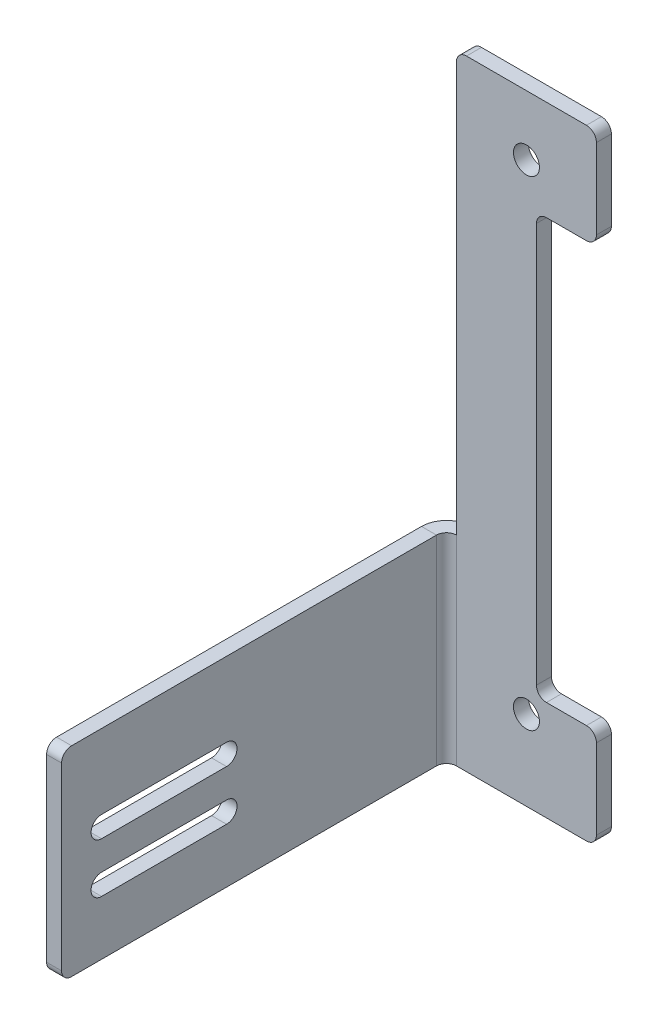
ISO-10303-21;
HEADER;
FILE_DESCRIPTION(('STEP AP214'),'2;1');
FILE_NAME('part.step','',(''),(''),'','','');
FILE_SCHEMA(('AUTOMOTIVE_DESIGN { 1 0 10303 214 1 1 1 1 }'));
ENDSEC;
DATA;
#1=APPLICATION_CONTEXT('core data for automotive mechanical design processes');
#2=APPLICATION_PROTOCOL_DEFINITION('international standard','automotive_design',2000,#1);
#3=PRODUCT_CONTEXT('',#1,'mechanical');
#4=PRODUCT('Part','Part','',(#3));
#5=PRODUCT_RELATED_PRODUCT_CATEGORY('part','',(#4));
#6=PRODUCT_DEFINITION_FORMATION('','',#4);
#7=PRODUCT_DEFINITION_CONTEXT('part definition',#1,'design');
#8=PRODUCT_DEFINITION('design','',#6,#7);
#9=PRODUCT_DEFINITION_SHAPE('','',#8);
#10=(LENGTH_UNIT() NAMED_UNIT(*) SI_UNIT(.MILLI.,.METRE.));
#11=(NAMED_UNIT(*) PLANE_ANGLE_UNIT() SI_UNIT($,.RADIAN.));
#12=(NAMED_UNIT(*) SI_UNIT($,.STERADIAN.) SOLID_ANGLE_UNIT());
#13=UNCERTAINTY_MEASURE_WITH_UNIT(LENGTH_MEASURE(1.E-05),#10,'distance_accuracy_value','');
#14=(GEOMETRIC_REPRESENTATION_CONTEXT(3) GLOBAL_UNCERTAINTY_ASSIGNED_CONTEXT((#13)) GLOBAL_UNIT_ASSIGNED_CONTEXT((#10,
#11,#12)) REPRESENTATION_CONTEXT('',''));
#15=CARTESIAN_POINT('',(0.,0.,0.));
#16=DIRECTION('',(0.,0.,1.));
#17=DIRECTION('',(1.,0.,0.));
#18=AXIS2_PLACEMENT_3D('',#15,#16,#17);
#19=CARTESIAN_POINT('',(-2.40951580484752E-13,-39.,69.));
#20=DIRECTION('',(1.,0.,0.));
#21=DIRECTION('',(0.,0.,-1.));
#22=AXIS2_PLACEMENT_3D('',#19,#20,#21);
#23=CYLINDRICAL_SURFACE('',#22,2.1);
#24=DIRECTION('',(1.,0.,0.));
#25=VECTOR('',#24,1.);
#26=CARTESIAN_POINT('',(-3.00000000000076,-36.9,69.));
#27=LINE('',#26,#25);
#28=CARTESIAN_POINT('',(-3.00000000000076,-36.9,69.));
#29=VERTEX_POINT('',#28);
#30=CARTESIAN_POINT('',(-2.40912212380176E-13,-36.9,69.));
#31=VERTEX_POINT('',#30);
#32=EDGE_CURVE('E287',#29,#31,#27,.T.);
#33=ORIENTED_EDGE('',*,*,#32,.T.);
#34=CARTESIAN_POINT('',(-2.40902594612786E-13,-39.,69.));
#35=DIRECTION('',(1.,0.,0.));
#36=DIRECTION('',(0.,0.,-1.));
#37=AXIS2_PLACEMENT_3D('',#34,#35,#36);
#38=CIRCLE('',#37,2.1);
#39=CARTESIAN_POINT('',(-2.40912212380176E-13,-41.1,69.));
#40=VERTEX_POINT('',#39);
#41=EDGE_CURVE('E323',#31,#40,#38,.T.);
#42=ORIENTED_EDGE('',*,*,#41,.T.);
#43=DIRECTION('',(1.,0.,0.));
#44=VECTOR('',#43,1.);
#45=CARTESIAN_POINT('',(-3.00000000000076,-41.1,69.));
#46=LINE('',#45,#44);
#47=CARTESIAN_POINT('',(-3.00000000000052,-41.1,69.));
#48=VERTEX_POINT('',#47);
#49=EDGE_CURVE('E305',#48,#40,#46,.T.);
#50=ORIENTED_EDGE('',*,*,#49,.F.);
#51=CARTESIAN_POINT('',(-3.00000000000052,-39.,69.));
#52=DIRECTION('',(1.,0.,0.));
#53=DIRECTION('',(0.,0.,-1.));
#54=AXIS2_PLACEMENT_3D('',#51,#52,#53);
#55=CIRCLE('',#54,2.1);
#56=EDGE_CURVE('E326',#29,#48,#55,.T.);
#57=ORIENTED_EDGE('',*,*,#56,.F.);
#58=EDGE_LOOP('',(#33,#42,#50,#57));
#59=FACE_BOUND('',#58,.T.);
#60=ADVANCED_FACE('F54',(#59),#23,.F.);
#61=CARTESIAN_POINT('',(-2.40951580484752E-13,-49.,69.));
#62=DIRECTION('',(1.,0.,0.));
#63=DIRECTION('',(0.,0.,-1.));
#64=AXIS2_PLACEMENT_3D('',#61,#62,#63);
#65=CYLINDRICAL_SURFACE('',#64,2.1);
#66=DIRECTION('',(1.,0.,0.));
#67=VECTOR('',#66,1.);
#68=CARTESIAN_POINT('',(-3.00000000000076,-46.9,69.));
#69=LINE('',#68,#67);
#70=CARTESIAN_POINT('',(-3.00000000000076,-46.9,69.));
#71=VERTEX_POINT('',#70);
#72=CARTESIAN_POINT('',(-2.40912212380176E-13,-46.9,69.));
#73=VERTEX_POINT('',#72);
#74=EDGE_CURVE('E289',#71,#73,#69,.T.);
#75=ORIENTED_EDGE('',*,*,#74,.T.);
#76=CARTESIAN_POINT('',(-2.40902594612786E-13,-49.,69.));
#77=DIRECTION('',(1.,0.,0.));
#78=DIRECTION('',(0.,0.,-1.));
#79=AXIS2_PLACEMENT_3D('',#76,#77,#78);
#80=CIRCLE('',#79,2.1);
#81=CARTESIAN_POINT('',(-2.40912212380176E-13,-51.1,69.));
#82=VERTEX_POINT('',#81);
#83=EDGE_CURVE('E292',#73,#82,#80,.T.);
#84=ORIENTED_EDGE('',*,*,#83,.T.);
#85=DIRECTION('',(1.,0.,0.));
#86=VECTOR('',#85,1.);
#87=CARTESIAN_POINT('',(-3.00000000000076,-51.1,69.));
#88=LINE('',#87,#86);
#89=CARTESIAN_POINT('',(-3.00000000000052,-51.1,69.));
#90=VERTEX_POINT('',#89);
#91=EDGE_CURVE('E265',#90,#82,#88,.T.);
#92=ORIENTED_EDGE('',*,*,#91,.F.);
#93=CARTESIAN_POINT('',(-3.00000000000052,-49.,69.));
#94=DIRECTION('',(1.,0.,0.));
#95=DIRECTION('',(0.,0.,-1.));
#96=AXIS2_PLACEMENT_3D('',#93,#94,#95);
#97=CIRCLE('',#96,2.1);
#98=EDGE_CURVE('E279',#71,#90,#97,.T.);
#99=ORIENTED_EDGE('',*,*,#98,.F.);
#100=EDGE_LOOP('',(#75,#84,#92,#99));
#101=FACE_BOUND('',#100,.T.);
#102=ADVANCED_FACE('F573',(#101),#65,.F.);
#103=CARTESIAN_POINT('',(1.99999999999999,-22.,2.));
#104=DIRECTION('',(0.,1.,0.));
#105=DIRECTION('',(0.,0.,1.));
#106=AXIS2_PLACEMENT_3D('',#103,#104,#105);
#107=PLANE('',#106);
#108=DIRECTION('',(0.,0.,1.));
#109=VECTOR('',#108,1.);
#110=CARTESIAN_POINT('',(-3.00000000000001,-22.,1.99999999999998));
#111=LINE('',#110,#109);
#112=CARTESIAN_POINT('',(-3.00000000000001,-22.,1.99999999999998));
#113=VERTEX_POINT('',#112);
#114=CARTESIAN_POINT('',(-3.00000000000026,-22.,75.));
#115=VERTEX_POINT('',#114);
#116=EDGE_CURVE('E350',#113,#115,#111,.T.);
#117=ORIENTED_EDGE('',*,*,#116,.T.);
#118=DIRECTION('',(1.,0.,0.));
#119=VECTOR('',#118,1.);
#120=CARTESIAN_POINT('',(-2.61943244872498E-13,-22.,75.));
#121=LINE('',#120,#119);
#122=CARTESIAN_POINT('',(-2.61859925245934E-13,-22.,75.));
#123=VERTEX_POINT('',#122);
#124=EDGE_CURVE('E504',#115,#123,#121,.T.);
#125=ORIENTED_EDGE('',*,*,#124,.T.);
#126=DIRECTION('',(0.,0.,-1.));
#127=VECTOR('',#126,1.);
#128=CARTESIAN_POINT('',(-2.68844063090921E-13,-22.,77.));
#129=LINE('',#128,#127);
#130=CARTESIAN_POINT('',(0.,-22.,1.99999999999999));
#131=VERTEX_POINT('',#130);
#132=EDGE_CURVE('E352',#123,#131,#129,.T.);
#133=ORIENTED_EDGE('',*,*,#132,.T.);
#134=DIRECTION('',(-1.,0.,0.));
#135=VECTOR('',#134,1.);
#136=CARTESIAN_POINT('',(0.,-22.,1.99999999999999));
#137=LINE('',#136,#135);
#138=EDGE_CURVE('E415',#131,#113,#137,.T.);
#139=ORIENTED_EDGE('',*,*,#138,.T.);
#140=EDGE_LOOP('',(#117,#125,#133,#139));
#141=FACE_BOUND('',#140,.T.);
#142=ADVANCED_FACE('F579',(#141),#107,.T.);
#143=CARTESIAN_POINT('',(1.99999999999999,-62.,2.));
#144=DIRECTION('',(0.,-1.,0.));
#145=DIRECTION('',(-1.,0.,0.));
#146=AXIS2_PLACEMENT_3D('',#143,#144,#145);
#147=CYLINDRICAL_SURFACE('',#146,5.);
#148=DIRECTION('',(0.,1.,0.));
#149=VECTOR('',#148,1.);
#150=CARTESIAN_POINT('',(-3.00000000000001,0.,1.99999999999998));
#151=LINE('',#150,#149);
#152=CARTESIAN_POINT('',(-3.00000000000001,-62.,1.99999999999998));
#153=VERTEX_POINT('',#152);
#154=EDGE_CURVE('E365',#153,#113,#151,.T.);
#155=ORIENTED_EDGE('',*,*,#154,.T.);
#156=CARTESIAN_POINT('',(1.99999999999999,-22.,2.));
#157=DIRECTION('',(0.,1.,0.));
#158=DIRECTION('',(0.,0.,1.));
#159=AXIS2_PLACEMENT_3D('',#156,#157,#158);
#160=CIRCLE('',#159,5.);
#161=CARTESIAN_POINT('',(1.99999999999999,-22.,-3.));
#162=VERTEX_POINT('',#161);
#163=EDGE_CURVE('E347',#162,#113,#160,.T.);
#164=ORIENTED_EDGE('',*,*,#163,.F.);
#165=DIRECTION('',(0.,-1.,0.));
#166=VECTOR('',#165,1.);
#167=CARTESIAN_POINT('',(1.99999999999999,-62.,-3.));
#168=LINE('',#167,#166);
#169=CARTESIAN_POINT('',(1.99999999999999,-62.,-3.));
#170=VERTEX_POINT('',#169);
#171=EDGE_CURVE('E378',#170,#162,#168,.F.);
#172=ORIENTED_EDGE('',*,*,#171,.F.);
#173=CARTESIAN_POINT('',(1.99999999999999,-62.,2.));
#174=DIRECTION('',(0.,-1.,0.));
#175=DIRECTION('',(0.,0.,-1.));
#176=AXIS2_PLACEMENT_3D('',#173,#174,#175);
#177=CIRCLE('',#176,5.);
#178=EDGE_CURVE('E382',#153,#170,#177,.T.);
#179=ORIENTED_EDGE('',*,*,#178,.F.);
#180=EDGE_LOOP('',(#155,#164,#172,#179));
#181=FACE_BOUND('',#180,.T.);
#182=ADVANCED_FACE('F552',(#181),#147,.T.);
#183=CARTESIAN_POINT('',(1.99999999999999,-62.,2.));
#184=DIRECTION('',(0.,-1.,0.));
#185=DIRECTION('',(-1.,0.,0.));
#186=AXIS2_PLACEMENT_3D('',#183,#184,#185);
#187=CYLINDRICAL_SURFACE('',#186,2.);
#188=CARTESIAN_POINT('',(1.99999999999999,-22.,2.));
#189=DIRECTION('',(0.,-1.,0.));
#190=DIRECTION('',(0.,0.,1.));
#191=AXIS2_PLACEMENT_3D('',#188,#189,#190);
#192=CIRCLE('',#191,2.);
#193=CARTESIAN_POINT('',(1.99999999999999,-22.,0.));
#194=VERTEX_POINT('',#193);
#195=EDGE_CURVE('E341',#131,#194,#192,.T.);
#196=ORIENTED_EDGE('',*,*,#195,.F.);
#197=DIRECTION('',(0.,-1.,0.));
#198=VECTOR('',#197,1.);
#199=CARTESIAN_POINT('',(0.,62.,1.99999999999999));
#200=LINE('',#199,#198);
#201=CARTESIAN_POINT('',(0.,-62.,1.99999999999999));
#202=VERTEX_POINT('',#201);
#203=EDGE_CURVE('E358',#131,#202,#200,.T.);
#204=ORIENTED_EDGE('',*,*,#203,.T.);
#205=CARTESIAN_POINT('',(1.99999999999999,-62.,2.));
#206=DIRECTION('',(0.,-1.,0.));
#207=DIRECTION('',(0.,0.,-1.));
#208=AXIS2_PLACEMENT_3D('',#205,#206,#207);
#209=CIRCLE('',#208,2.);
#210=CARTESIAN_POINT('',(1.99999999999999,-62.,0.));
#211=VERTEX_POINT('',#210);
#212=EDGE_CURVE('E374',#202,#211,#209,.T.);
#213=ORIENTED_EDGE('',*,*,#212,.T.);
#214=DIRECTION('',(0.,-1.,0.));
#215=VECTOR('',#214,1.);
#216=CARTESIAN_POINT('',(1.99999999999999,-62.,0.));
#217=LINE('',#216,#215);
#218=EDGE_CURVE('E385',#211,#194,#217,.F.);
#219=ORIENTED_EDGE('',*,*,#218,.T.);
#220=EDGE_LOOP('',(#196,#204,#213,#219));
#221=FACE_BOUND('',#220,.T.);
#222=ADVANCED_FACE('F599',(#221),#187,.F.);
#223=CARTESIAN_POINT('',(-3.,0.,0.));
#224=DIRECTION('',(1.,0.,0.));
#225=DIRECTION('',(0.,0.,-1.));
#226=AXIS2_PLACEMENT_3D('',#223,#224,#225);
#227=PLANE('',#226);
#228=CARTESIAN_POINT('',(-3.00000000000068,-49.,44.));
#229=DIRECTION('',(1.,0.,0.));
#230=DIRECTION('',(0.,0.,-1.));
#231=AXIS2_PLACEMENT_3D('',#228,#229,#230);
#232=CIRCLE('',#231,2.09999999999999);
#233=CARTESIAN_POINT('',(-3.00000000000068,-51.1,44.));
#234=VERTEX_POINT('',#233);
#235=CARTESIAN_POINT('',(-3.00000000000068,-46.9,44.));
#236=VERTEX_POINT('',#235);
#237=EDGE_CURVE('E268',#234,#236,#232,.T.);
#238=ORIENTED_EDGE('',*,*,#237,.T.);
#239=DIRECTION('',(0.,0.,1.));
#240=VECTOR('',#239,1.);
#241=CARTESIAN_POINT('',(-3.00000000000076,-46.9,69.));
#242=LINE('',#241,#240);
#243=EDGE_CURVE('E273',#236,#71,#242,.T.);
#244=ORIENTED_EDGE('',*,*,#243,.T.);
#245=ORIENTED_EDGE('',*,*,#98,.T.);
#246=DIRECTION('',(0.,0.,-1.));
#247=VECTOR('',#246,1.);
#248=CARTESIAN_POINT('',(-3.00000000000076,-51.1,69.));
#249=LINE('',#248,#247);
#250=EDGE_CURVE('E257',#90,#234,#249,.T.);
#251=ORIENTED_EDGE('',*,*,#250,.T.);
#252=EDGE_LOOP('',(#238,#244,#245,#251));
#253=FACE_BOUND('',#252,.T.);
#254=CARTESIAN_POINT('',(-3.00000000000068,-39.,44.));
#255=DIRECTION('',(1.,0.,0.));
#256=DIRECTION('',(0.,0.,-1.));
#257=AXIS2_PLACEMENT_3D('',#254,#255,#256);
#258=CIRCLE('',#257,2.09999999999999);
#259=CARTESIAN_POINT('',(-3.00000000000068,-41.1,44.));
#260=VERTEX_POINT('',#259);
#261=CARTESIAN_POINT('',(-3.00000000000068,-36.9,44.));
#262=VERTEX_POINT('',#261);
#263=EDGE_CURVE('E298',#260,#262,#258,.T.);
#264=ORIENTED_EDGE('',*,*,#263,.T.);
#265=DIRECTION('',(0.,0.,1.));
#266=VECTOR('',#265,1.);
#267=CARTESIAN_POINT('',(-3.00000000000076,-36.9,69.));
#268=LINE('',#267,#266);
#269=EDGE_CURVE('E302',#262,#29,#268,.T.);
#270=ORIENTED_EDGE('',*,*,#269,.T.);
#271=ORIENTED_EDGE('',*,*,#56,.T.);
#272=DIRECTION('',(0.,0.,-1.));
#273=VECTOR('',#272,1.);
#274=CARTESIAN_POINT('',(-3.00000000000076,-41.1,69.));
#275=LINE('',#274,#273);
#276=EDGE_CURVE('E295',#48,#260,#275,.T.);
#277=ORIENTED_EDGE('',*,*,#276,.T.);
#278=EDGE_LOOP('',(#264,#270,#271,#277));
#279=FACE_BOUND('',#278,.T.);
#280=DIRECTION('',(0.,0.,1.));
#281=VECTOR('',#280,1.);
#282=CARTESIAN_POINT('',(-3.00000000000027,-62.,77.));
#283=LINE('',#282,#281);
#284=CARTESIAN_POINT('',(-3.00000000000026,-62.,75.));
#285=VERTEX_POINT('',#284);
#286=EDGE_CURVE('E369',#153,#285,#283,.T.);
#287=ORIENTED_EDGE('',*,*,#286,.T.);
#288=CARTESIAN_POINT('',(-3.00000000000026,-60.,75.));
#289=DIRECTION('',(1.,0.,0.));
#290=DIRECTION('',(0.,0.,-1.));
#291=AXIS2_PLACEMENT_3D('',#288,#289,#290);
#292=CIRCLE('',#291,2.);
#293=CARTESIAN_POINT('',(-3.00000000000027,-60.,77.));
#294=VERTEX_POINT('',#293);
#295=EDGE_CURVE('E502',#285,#294,#292,.F.);
#296=ORIENTED_EDGE('',*,*,#295,.T.);
#297=DIRECTION('',(0.,1.,0.));
#298=VECTOR('',#297,1.);
#299=CARTESIAN_POINT('',(-3.00000000000027,62.,77.));
#300=LINE('',#299,#298);
#301=CARTESIAN_POINT('',(-3.00000000000027,-24.,77.));
#302=VERTEX_POINT('',#301);
#303=EDGE_CURVE('E371',#294,#302,#300,.T.);
#304=ORIENTED_EDGE('',*,*,#303,.T.);
#305=CARTESIAN_POINT('',(-3.00000000000026,-24.,75.));
#306=DIRECTION('',(1.,0.,0.));
#307=DIRECTION('',(0.,0.,-1.));
#308=AXIS2_PLACEMENT_3D('',#305,#306,#307);
#309=CIRCLE('',#308,2.);
#310=EDGE_CURVE('E69',#302,#115,#309,.F.);
#311=ORIENTED_EDGE('',*,*,#310,.T.);
#312=ORIENTED_EDGE('',*,*,#116,.F.);
#313=ORIENTED_EDGE('',*,*,#154,.F.);
#314=EDGE_LOOP('',(#287,#296,#304,#311,#312,#313));
#315=FACE_BOUND('',#314,.T.);
#316=ADVANCED_FACE('F276',(#253,#279,#315),#227,.F.);
#317=CARTESIAN_POINT('',(0.,0.,0.));
#318=DIRECTION('',(1.,0.,0.));
#319=DIRECTION('',(0.,0.,-1.));
#320=AXIS2_PLACEMENT_3D('',#317,#318,#319);
#321=PLANE('',#320);
#322=DIRECTION('',(0.,0.,1.));
#323=VECTOR('',#322,1.);
#324=CARTESIAN_POINT('',(-2.40912212380176E-13,-46.9,69.));
#325=LINE('',#324,#323);
#326=CARTESIAN_POINT('',(-1.53625178909098E-13,-46.9,44.));
#327=VERTEX_POINT('',#326);
#328=EDGE_CURVE('E280',#327,#73,#325,.T.);
#329=ORIENTED_EDGE('',*,*,#328,.F.);
#330=CARTESIAN_POINT('',(-1.53625178909098E-13,-49.,44.));
#331=DIRECTION('',(1.,0.,0.));
#332=DIRECTION('',(0.,0.,-1.));
#333=AXIS2_PLACEMENT_3D('',#330,#331,#332);
#334=CIRCLE('',#333,2.09999999999999);
#335=CARTESIAN_POINT('',(-1.53625178909098E-13,-51.1,44.));
#336=VERTEX_POINT('',#335);
#337=EDGE_CURVE('E282',#336,#327,#334,.T.);
#338=ORIENTED_EDGE('',*,*,#337,.F.);
#339=DIRECTION('',(0.,0.,-1.));
#340=VECTOR('',#339,1.);
#341=CARTESIAN_POINT('',(-2.40912212380176E-13,-51.1,69.));
#342=LINE('',#341,#340);
#343=EDGE_CURVE('E260',#82,#336,#342,.T.);
#344=ORIENTED_EDGE('',*,*,#343,.F.);
#345=ORIENTED_EDGE('',*,*,#83,.F.);
#346=EDGE_LOOP('',(#329,#338,#344,#345));
#347=FACE_BOUND('',#346,.T.);
#348=DIRECTION('',(0.,0.,1.));
#349=VECTOR('',#348,1.);
#350=CARTESIAN_POINT('',(-2.40912212380176E-13,-36.9,69.));
#351=LINE('',#350,#349);
#352=CARTESIAN_POINT('',(-1.53625178909098E-13,-36.9,44.));
#353=VERTEX_POINT('',#352);
#354=EDGE_CURVE('E299',#353,#31,#351,.T.);
#355=ORIENTED_EDGE('',*,*,#354,.F.);
#356=CARTESIAN_POINT('',(-1.53625178909098E-13,-39.,44.));
#357=DIRECTION('',(1.,0.,0.));
#358=DIRECTION('',(0.,0.,-1.));
#359=AXIS2_PLACEMENT_3D('',#356,#357,#358);
#360=CIRCLE('',#359,2.09999999999999);
#361=CARTESIAN_POINT('',(-1.53625178909098E-13,-41.1,44.));
#362=VERTEX_POINT('',#361);
#363=EDGE_CURVE('E309',#362,#353,#360,.T.);
#364=ORIENTED_EDGE('',*,*,#363,.F.);
#365=DIRECTION('',(0.,0.,-1.));
#366=VECTOR('',#365,1.);
#367=CARTESIAN_POINT('',(-2.40912212380176E-13,-41.1,69.));
#368=LINE('',#367,#366);
#369=EDGE_CURVE('E306',#40,#362,#368,.T.);
#370=ORIENTED_EDGE('',*,*,#369,.F.);
#371=ORIENTED_EDGE('',*,*,#41,.F.);
#372=EDGE_LOOP('',(#355,#364,#370,#371));
#373=FACE_BOUND('',#372,.T.);
#374=DIRECTION('',(0.,1.,0.));
#375=VECTOR('',#374,1.);
#376=CARTESIAN_POINT('',(-2.68844063090921E-13,62.,77.));
#377=LINE('',#376,#375);
#378=CARTESIAN_POINT('',(-2.68844063090921E-13,-60.,77.));
#379=VERTEX_POINT('',#378);
#380=CARTESIAN_POINT('',(-2.68844063090921E-13,-24.,77.));
#381=VERTEX_POINT('',#380);
#382=EDGE_CURVE('E372',#379,#381,#377,.T.);
#383=ORIENTED_EDGE('',*,*,#382,.F.);
#384=CARTESIAN_POINT('',(-2.61943244872498E-13,-60.,75.));
#385=DIRECTION('',(1.,0.,0.));
#386=DIRECTION('',(0.,0.,-1.));
#387=AXIS2_PLACEMENT_3D('',#384,#385,#386);
#388=CIRCLE('',#387,2.);
#389=CARTESIAN_POINT('',(-2.61861100413235E-13,-62.,75.));
#390=VERTEX_POINT('',#389);
#391=EDGE_CURVE('E498',#379,#390,#388,.T.);
#392=ORIENTED_EDGE('',*,*,#391,.T.);
#393=DIRECTION('',(0.,0.,1.));
#394=VECTOR('',#393,1.);
#395=CARTESIAN_POINT('',(-2.68844063090921E-13,-62.,77.));
#396=LINE('',#395,#394);
#397=EDGE_CURVE('E368',#202,#390,#396,.T.);
#398=ORIENTED_EDGE('',*,*,#397,.F.);
#399=ORIENTED_EDGE('',*,*,#203,.F.);
#400=ORIENTED_EDGE('',*,*,#132,.F.);
#401=CARTESIAN_POINT('',(-2.61943244872498E-13,-24.,75.));
#402=DIRECTION('',(1.,0.,0.));
#403=DIRECTION('',(0.,0.,-1.));
#404=AXIS2_PLACEMENT_3D('',#401,#402,#403);
#405=CIRCLE('',#404,2.);
#406=EDGE_CURVE('E496',#123,#381,#405,.T.);
#407=ORIENTED_EDGE('',*,*,#406,.T.);
#408=EDGE_LOOP('',(#383,#392,#398,#399,#400,#407));
#409=FACE_BOUND('',#408,.T.);
#410=ADVANCED_FACE('F598',(#347,#373,#409),#321,.T.);
#411=CARTESIAN_POINT('',(-3.00000000000027,62.,77.));
#412=DIRECTION('',(0.,0.,-1.));
#413=DIRECTION('',(-1.,0.,0.));
#414=AXIS2_PLACEMENT_3D('',#411,#412,#413);
#415=PLANE('',#414);
#416=ORIENTED_EDGE('',*,*,#303,.F.);
#417=DIRECTION('',(1.,0.,0.));
#418=VECTOR('',#417,1.);
#419=CARTESIAN_POINT('',(-3.00000000000027,-60.,77.));
#420=LINE('',#419,#418);
#421=EDGE_CURVE('E493',#294,#379,#420,.T.);
#422=ORIENTED_EDGE('',*,*,#421,.T.);
#423=ORIENTED_EDGE('',*,*,#382,.T.);
#424=DIRECTION('',(1.,0.,0.));
#425=VECTOR('',#424,1.);
#426=CARTESIAN_POINT('',(-3.00000000000027,-24.,77.));
#427=LINE('',#426,#425);
#428=EDGE_CURVE('E491',#381,#302,#427,.F.);
#429=ORIENTED_EDGE('',*,*,#428,.T.);
#430=EDGE_LOOP('',(#416,#422,#423,#429));
#431=FACE_BOUND('',#430,.T.);
#432=ADVANCED_FACE('F601',(#431),#415,.F.);
#433=CARTESIAN_POINT('',(0.,-62.,-3.));
#434=DIRECTION('',(0.,-1.,0.));
#435=DIRECTION('',(0.,0.,-1.));
#436=AXIS2_PLACEMENT_3D('',#433,#434,#435);
#437=PLANE('',#436);
#438=DIRECTION('',(1.,0.,0.));
#439=VECTOR('',#438,1.);
#440=CARTESIAN_POINT('',(0.,-62.,-3.));
#441=LINE('',#440,#439);
#442=CARTESIAN_POINT('',(28.,-62.,-3.));
#443=VERTEX_POINT('',#442);
#444=EDGE_CURVE('E393',#170,#443,#441,.T.);
#445=ORIENTED_EDGE('',*,*,#444,.T.);
#446=DIRECTION('',(0.,0.,1.));
#447=VECTOR('',#446,1.);
#448=CARTESIAN_POINT('',(28.,-62.,-3.));
#449=LINE('',#448,#447);
#450=CARTESIAN_POINT('',(28.,-62.,0.));
#451=VERTEX_POINT('',#450);
#452=EDGE_CURVE('E476',#443,#451,#449,.T.);
#453=ORIENTED_EDGE('',*,*,#452,.T.);
#454=DIRECTION('',(1.,0.,0.));
#455=VECTOR('',#454,1.);
#456=CARTESIAN_POINT('',(0.,-62.,0.));
#457=LINE('',#456,#455);
#458=EDGE_CURVE('E392',#211,#451,#457,.T.);
#459=ORIENTED_EDGE('',*,*,#458,.F.);
#460=DIRECTION('',(0.,0.,-1.));
#461=VECTOR('',#460,1.);
#462=CARTESIAN_POINT('',(1.99999999999999,-62.,0.));
#463=LINE('',#462,#461);
#464=EDGE_CURVE('E381',#211,#170,#463,.T.);
#465=ORIENTED_EDGE('',*,*,#464,.T.);
#466=EDGE_LOOP('',(#445,#453,#459,#465));
#467=FACE_BOUND('',#466,.T.);
#468=ADVANCED_FACE('F544',(#467),#437,.T.);
#469=CARTESIAN_POINT('',(0.,0.,-3.));
#470=DIRECTION('',(0.,0.,1.));
#471=DIRECTION('',(1.,0.,0.));
#472=AXIS2_PLACEMENT_3D('',#469,#470,#471);
#473=PLANE('',#472);
#474=CARTESIAN_POINT('',(16.,-46.,-3.));
#475=DIRECTION('',(0.,0.,1.));
#476=DIRECTION('',(1.,0.,0.));
#477=AXIS2_PLACEMENT_3D('',#474,#475,#476);
#478=CIRCLE('',#477,2.6);
#479=CARTESIAN_POINT('',(18.6,-46.,-3.));
#480=VERTEX_POINT('',#479);
#481=EDGE_CURVE('E332',#480,#480,#478,.T.);
#482=ORIENTED_EDGE('',*,*,#481,.T.);
#483=EDGE_LOOP('',(#482));
#484=FACE_BOUND('',#483,.T.);
#485=CARTESIAN_POINT('',(16.,50.,-3.));
#486=DIRECTION('',(0.,0.,1.));
#487=DIRECTION('',(1.,0.,0.));
#488=AXIS2_PLACEMENT_3D('',#485,#486,#487);
#489=CIRCLE('',#488,2.6);
#490=CARTESIAN_POINT('',(18.6,50.,-3.));
#491=VERTEX_POINT('',#490);
#492=EDGE_CURVE('E338',#491,#491,#489,.T.);
#493=ORIENTED_EDGE('',*,*,#492,.T.);
#494=EDGE_LOOP('',(#493));
#495=FACE_BOUND('',#494,.T.);
#496=DIRECTION('',(0.,1.,0.));
#497=VECTOR('',#496,1.);
#498=CARTESIAN_POINT('',(30.,62.,-3.));
#499=LINE('',#498,#497);
#500=CARTESIAN_POINT('',(30.,44.,-3.));
#501=VERTEX_POINT('',#500);
#502=CARTESIAN_POINT('',(30.,60.,-3.));
#503=VERTEX_POINT('',#502);
#504=EDGE_CURVE('E409',#501,#503,#499,.T.);
#505=ORIENTED_EDGE('',*,*,#504,.F.);
#506=CARTESIAN_POINT('',(28.,44.,-3.));
#507=DIRECTION('',(0.,0.,1.));
#508=DIRECTION('',(1.,0.,0.));
#509=AXIS2_PLACEMENT_3D('',#506,#507,#508);
#510=CIRCLE('',#509,2.);
#511=CARTESIAN_POINT('',(28.,42.,-3.));
#512=VERTEX_POINT('',#511);
#513=EDGE_CURVE('E469',#501,#512,#510,.F.);
#514=ORIENTED_EDGE('',*,*,#513,.T.);
#515=DIRECTION('',(1.,0.,0.));
#516=VECTOR('',#515,1.);
#517=CARTESIAN_POINT('',(30.,42.,-3.));
#518=LINE('',#517,#516);
#519=CARTESIAN_POINT('',(20.,42.,-3.));
#520=VERTEX_POINT('',#519);
#521=EDGE_CURVE('E406',#520,#512,#518,.T.);
#522=ORIENTED_EDGE('',*,*,#521,.F.);
#523=CARTESIAN_POINT('',(20.,40.,-3.));
#524=DIRECTION('',(0.,0.,1.));
#525=DIRECTION('',(1.,0.,0.));
#526=AXIS2_PLACEMENT_3D('',#523,#524,#525);
#527=CIRCLE('',#526,2.);
#528=CARTESIAN_POINT('',(18.,40.,-3.));
#529=VERTEX_POINT('',#528);
#530=EDGE_CURVE('E509',#520,#529,#527,.T.);
#531=ORIENTED_EDGE('',*,*,#530,.T.);
#532=DIRECTION('',(0.,1.,0.));
#533=VECTOR('',#532,1.);
#534=CARTESIAN_POINT('',(18.,-42.,-3.));
#535=LINE('',#534,#533);
#536=CARTESIAN_POINT('',(18.,-40.,-3.));
#537=VERTEX_POINT('',#536);
#538=EDGE_CURVE('E403',#537,#529,#535,.T.);
#539=ORIENTED_EDGE('',*,*,#538,.F.);
#540=CARTESIAN_POINT('',(20.,-40.,-3.));
#541=DIRECTION('',(0.,0.,1.));
#542=DIRECTION('',(1.,0.,0.));
#543=AXIS2_PLACEMENT_3D('',#540,#541,#542);
#544=CIRCLE('',#543,2.);
#545=CARTESIAN_POINT('',(20.,-42.,-3.));
#546=VERTEX_POINT('',#545);
#547=EDGE_CURVE('E14',#537,#546,#544,.T.);
#548=ORIENTED_EDGE('',*,*,#547,.T.);
#549=DIRECTION('',(-1.,0.,0.));
#550=VECTOR('',#549,1.);
#551=CARTESIAN_POINT('',(30.,-42.,-3.));
#552=LINE('',#551,#550);
#553=CARTESIAN_POINT('',(28.,-42.,-3.));
#554=VERTEX_POINT('',#553);
#555=EDGE_CURVE('E400',#554,#546,#552,.T.);
#556=ORIENTED_EDGE('',*,*,#555,.F.);
#557=CARTESIAN_POINT('',(28.,-44.,-3.));
#558=DIRECTION('',(0.,0.,1.));
#559=DIRECTION('',(1.,0.,0.));
#560=AXIS2_PLACEMENT_3D('',#557,#558,#559);
#561=CIRCLE('',#560,2.);
#562=CARTESIAN_POINT('',(30.,-44.,-3.));
#563=VERTEX_POINT('',#562);
#564=EDGE_CURVE('E461',#554,#563,#561,.F.);
#565=ORIENTED_EDGE('',*,*,#564,.T.);
#566=DIRECTION('',(0.,1.,0.));
#567=VECTOR('',#566,1.);
#568=CARTESIAN_POINT('',(30.,-42.,-3.));
#569=LINE('',#568,#567);
#570=CARTESIAN_POINT('',(30.,-60.,-3.));
#571=VERTEX_POINT('',#570);
#572=EDGE_CURVE('E396',#571,#563,#569,.T.);
#573=ORIENTED_EDGE('',*,*,#572,.F.);
#574=CARTESIAN_POINT('',(28.,-60.,-3.));
#575=DIRECTION('',(0.,0.,1.));
#576=DIRECTION('',(1.,0.,0.));
#577=AXIS2_PLACEMENT_3D('',#574,#575,#576);
#578=CIRCLE('',#577,2.);
#579=EDGE_CURVE('E467',#571,#443,#578,.F.);
#580=ORIENTED_EDGE('',*,*,#579,.T.);
#581=ORIENTED_EDGE('',*,*,#444,.F.);
#582=ORIENTED_EDGE('',*,*,#171,.T.);
#583=DIRECTION('',(0.,1.,0.));
#584=VECTOR('',#583,1.);
#585=CARTESIAN_POINT('',(1.99999999999999,-22.,-3.));
#586=LINE('',#585,#584);
#587=CARTESIAN_POINT('',(1.99999999999999,60.,-3.));
#588=VERTEX_POINT('',#587);
#589=EDGE_CURVE('E355',#162,#588,#586,.T.);
#590=ORIENTED_EDGE('',*,*,#589,.T.);
#591=CARTESIAN_POINT('',(3.99999999999999,60.,-3.));
#592=DIRECTION('',(0.,0.,1.));
#593=DIRECTION('',(1.,0.,0.));
#594=AXIS2_PLACEMENT_3D('',#591,#592,#593);
#595=CIRCLE('',#594,2.);
#596=CARTESIAN_POINT('',(3.99999999999999,62.,-3.));
#597=VERTEX_POINT('',#596);
#598=EDGE_CURVE('E465',#588,#597,#595,.F.);
#599=ORIENTED_EDGE('',*,*,#598,.T.);
#600=DIRECTION('',(-1.,0.,0.));
#601=VECTOR('',#600,1.);
#602=CARTESIAN_POINT('',(0.,62.,-3.));
#603=LINE('',#602,#601);
#604=CARTESIAN_POINT('',(28.,62.,-3.));
#605=VERTEX_POINT('',#604);
#606=EDGE_CURVE('E412',#605,#597,#603,.T.);
#607=ORIENTED_EDGE('',*,*,#606,.F.);
#608=CARTESIAN_POINT('',(28.,60.,-3.));
#609=DIRECTION('',(0.,0.,1.));
#610=DIRECTION('',(1.,0.,0.));
#611=AXIS2_PLACEMENT_3D('',#608,#609,#610);
#612=CIRCLE('',#611,2.);
#613=EDGE_CURVE('E463',#605,#503,#612,.F.);
#614=ORIENTED_EDGE('',*,*,#613,.T.);
#615=EDGE_LOOP('',(#505,#514,#522,#531,#539,#548,#556,#565,#573,#580,#581,#582,#590,#599,#607,#614));
#616=FACE_BOUND('',#615,.T.);
#617=ADVANCED_FACE('F526',(#484,#495,#616),#473,.F.);
#618=CARTESIAN_POINT('',(0.,0.,0.));
#619=DIRECTION('',(0.,0.,1.));
#620=DIRECTION('',(1.,0.,0.));
#621=AXIS2_PLACEMENT_3D('',#618,#619,#620);
#622=PLANE('',#621);
#623=CARTESIAN_POINT('',(16.,-46.,0.));
#624=DIRECTION('',(0.,0.,1.));
#625=DIRECTION('',(1.,0.,0.));
#626=AXIS2_PLACEMENT_3D('',#623,#624,#625);
#627=CIRCLE('',#626,2.6);
#628=CARTESIAN_POINT('',(18.6,-46.,0.));
#629=VERTEX_POINT('',#628);
#630=EDGE_CURVE('E329',#629,#629,#627,.T.);
#631=ORIENTED_EDGE('',*,*,#630,.F.);
#632=EDGE_LOOP('',(#631));
#633=FACE_BOUND('',#632,.T.);
#634=CARTESIAN_POINT('',(16.,50.,0.));
#635=DIRECTION('',(0.,0.,1.));
#636=DIRECTION('',(1.,0.,0.));
#637=AXIS2_PLACEMENT_3D('',#634,#635,#636);
#638=CIRCLE('',#637,2.6);
#639=CARTESIAN_POINT('',(18.6,50.,0.));
#640=VERTEX_POINT('',#639);
#641=EDGE_CURVE('E335',#640,#640,#638,.T.);
#642=ORIENTED_EDGE('',*,*,#641,.F.);
#643=EDGE_LOOP('',(#642));
#644=FACE_BOUND('',#643,.T.);
#645=DIRECTION('',(1.,0.,0.));
#646=VECTOR('',#645,1.);
#647=CARTESIAN_POINT('',(30.,42.,0.));
#648=LINE('',#647,#646);
#649=CARTESIAN_POINT('',(20.,42.,0.));
#650=VERTEX_POINT('',#649);
#651=CARTESIAN_POINT('',(28.,42.,0.));
#652=VERTEX_POINT('',#651);
#653=EDGE_CURVE('E427',#650,#652,#648,.T.);
#654=ORIENTED_EDGE('',*,*,#653,.T.);
#655=CARTESIAN_POINT('',(28.,44.,0.));
#656=DIRECTION('',(0.,0.,1.));
#657=DIRECTION('',(1.,0.,0.));
#658=AXIS2_PLACEMENT_3D('',#655,#656,#657);
#659=CIRCLE('',#658,2.);
#660=CARTESIAN_POINT('',(30.,44.,0.));
#661=VERTEX_POINT('',#660);
#662=EDGE_CURVE('E454',#652,#661,#659,.T.);
#663=ORIENTED_EDGE('',*,*,#662,.T.);
#664=DIRECTION('',(0.,1.,0.));
#665=VECTOR('',#664,1.);
#666=CARTESIAN_POINT('',(30.,62.,0.));
#667=LINE('',#666,#665);
#668=CARTESIAN_POINT('',(30.,60.,0.));
#669=VERTEX_POINT('',#668);
#670=EDGE_CURVE('E430',#661,#669,#667,.T.);
#671=ORIENTED_EDGE('',*,*,#670,.T.);
#672=CARTESIAN_POINT('',(28.,60.,0.));
#673=DIRECTION('',(0.,0.,1.));
#674=DIRECTION('',(1.,0.,0.));
#675=AXIS2_PLACEMENT_3D('',#672,#673,#674);
#676=CIRCLE('',#675,2.);
#677=CARTESIAN_POINT('',(28.,62.,0.));
#678=VERTEX_POINT('',#677);
#679=EDGE_CURVE('E448',#669,#678,#676,.T.);
#680=ORIENTED_EDGE('',*,*,#679,.T.);
#681=DIRECTION('',(-1.,0.,0.));
#682=VECTOR('',#681,1.);
#683=CARTESIAN_POINT('',(0.,62.,0.));
#684=LINE('',#683,#682);
#685=CARTESIAN_POINT('',(3.99999999999999,62.,0.));
#686=VERTEX_POINT('',#685);
#687=EDGE_CURVE('E397',#678,#686,#684,.T.);
#688=ORIENTED_EDGE('',*,*,#687,.T.);
#689=CARTESIAN_POINT('',(3.99999999999999,60.,0.));
#690=DIRECTION('',(0.,0.,1.));
#691=DIRECTION('',(1.,0.,0.));
#692=AXIS2_PLACEMENT_3D('',#689,#690,#691);
#693=CIRCLE('',#692,2.);
#694=CARTESIAN_POINT('',(1.99999999999999,60.,0.));
#695=VERTEX_POINT('',#694);
#696=EDGE_CURVE('E450',#686,#695,#693,.T.);
#697=ORIENTED_EDGE('',*,*,#696,.T.);
#698=DIRECTION('',(0.,1.,0.));
#699=VECTOR('',#698,1.);
#700=CARTESIAN_POINT('',(1.99999999999999,-22.,0.));
#701=LINE('',#700,#699);
#702=EDGE_CURVE('E354',#194,#695,#701,.T.);
#703=ORIENTED_EDGE('',*,*,#702,.F.);
#704=ORIENTED_EDGE('',*,*,#218,.F.);
#705=ORIENTED_EDGE('',*,*,#458,.T.);
#706=CARTESIAN_POINT('',(28.,-60.,0.));
#707=DIRECTION('',(0.,0.,1.));
#708=DIRECTION('',(1.,0.,0.));
#709=AXIS2_PLACEMENT_3D('',#706,#707,#708);
#710=CIRCLE('',#709,2.);
#711=CARTESIAN_POINT('',(30.,-60.,0.));
#712=VERTEX_POINT('',#711);
#713=EDGE_CURVE('E452',#451,#712,#710,.T.);
#714=ORIENTED_EDGE('',*,*,#713,.T.);
#715=DIRECTION('',(0.,1.,0.));
#716=VECTOR('',#715,1.);
#717=CARTESIAN_POINT('',(30.,-42.,0.));
#718=LINE('',#717,#716);
#719=CARTESIAN_POINT('',(30.,-44.,0.));
#720=VERTEX_POINT('',#719);
#721=EDGE_CURVE('E418',#712,#720,#718,.T.);
#722=ORIENTED_EDGE('',*,*,#721,.T.);
#723=CARTESIAN_POINT('',(28.,-44.,0.));
#724=DIRECTION('',(0.,0.,1.));
#725=DIRECTION('',(1.,0.,0.));
#726=AXIS2_PLACEMENT_3D('',#723,#724,#725);
#727=CIRCLE('',#726,2.);
#728=CARTESIAN_POINT('',(28.,-42.,0.));
#729=VERTEX_POINT('',#728);
#730=EDGE_CURVE('E446',#720,#729,#727,.T.);
#731=ORIENTED_EDGE('',*,*,#730,.T.);
#732=DIRECTION('',(-1.,0.,0.));
#733=VECTOR('',#732,1.);
#734=CARTESIAN_POINT('',(30.,-42.,0.));
#735=LINE('',#734,#733);
#736=CARTESIAN_POINT('',(20.,-42.,0.));
#737=VERTEX_POINT('',#736);
#738=EDGE_CURVE('E421',#729,#737,#735,.T.);
#739=ORIENTED_EDGE('',*,*,#738,.T.);
#740=CARTESIAN_POINT('',(20.,-40.,0.));
#741=DIRECTION('',(0.,0.,1.));
#742=DIRECTION('',(1.,0.,0.));
#743=AXIS2_PLACEMENT_3D('',#740,#741,#742);
#744=CIRCLE('',#743,2.);
#745=CARTESIAN_POINT('',(18.,-40.,0.));
#746=VERTEX_POINT('',#745);
#747=EDGE_CURVE('E62',#737,#746,#744,.F.);
#748=ORIENTED_EDGE('',*,*,#747,.T.);
#749=DIRECTION('',(0.,1.,0.));
#750=VECTOR('',#749,1.);
#751=CARTESIAN_POINT('',(18.,-42.,0.));
#752=LINE('',#751,#750);
#753=CARTESIAN_POINT('',(18.,40.,0.));
#754=VERTEX_POINT('',#753);
#755=EDGE_CURVE('E424',#746,#754,#752,.T.);
#756=ORIENTED_EDGE('',*,*,#755,.T.);
#757=CARTESIAN_POINT('',(20.,40.,0.));
#758=DIRECTION('',(0.,0.,1.));
#759=DIRECTION('',(1.,0.,0.));
#760=AXIS2_PLACEMENT_3D('',#757,#758,#759);
#761=CIRCLE('',#760,2.);
#762=EDGE_CURVE('E507',#754,#650,#761,.F.);
#763=ORIENTED_EDGE('',*,*,#762,.T.);
#764=EDGE_LOOP('',(#654,#663,#671,#680,#688,#697,#703,#704,#705,#714,#722,#731,#739,#748,#756,#763));
#765=FACE_BOUND('',#764,.T.);
#766=ADVANCED_FACE('F512',(#633,#644,#765),#622,.T.);
#767=CARTESIAN_POINT('',(0.,62.,-3.));
#768=DIRECTION('',(0.,1.,0.));
#769=DIRECTION('',(-1.,0.,0.));
#770=AXIS2_PLACEMENT_3D('',#767,#768,#769);
#771=PLANE('',#770);
#772=ORIENTED_EDGE('',*,*,#606,.T.);
#773=DIRECTION('',(0.,0.,-1.));
#774=VECTOR('',#773,1.);
#775=CARTESIAN_POINT('',(3.99999999999999,62.,0.));
#776=LINE('',#775,#774);
#777=EDGE_CURVE('E489',#597,#686,#776,.F.);
#778=ORIENTED_EDGE('',*,*,#777,.T.);
#779=ORIENTED_EDGE('',*,*,#687,.F.);
#780=DIRECTION('',(0.,0.,1.));
#781=VECTOR('',#780,1.);
#782=CARTESIAN_POINT('',(28.,62.,-3.));
#783=LINE('',#782,#781);
#784=EDGE_CURVE('E487',#678,#605,#783,.F.);
#785=ORIENTED_EDGE('',*,*,#784,.T.);
#786=EDGE_LOOP('',(#772,#778,#779,#785));
#787=FACE_BOUND('',#786,.T.);
#788=ADVANCED_FACE('F633',(#787),#771,.T.);
#789=CARTESIAN_POINT('',(30.,62.,-3.));
#790=DIRECTION('',(1.,0.,0.));
#791=DIRECTION('',(0.,0.,-1.));
#792=AXIS2_PLACEMENT_3D('',#789,#790,#791);
#793=PLANE('',#792);
#794=ORIENTED_EDGE('',*,*,#670,.F.);
#795=DIRECTION('',(0.,0.,1.));
#796=VECTOR('',#795,1.);
#797=CARTESIAN_POINT('',(30.,44.,-3.));
#798=LINE('',#797,#796);
#799=EDGE_CURVE('E459',#661,#501,#798,.F.);
#800=ORIENTED_EDGE('',*,*,#799,.T.);
#801=ORIENTED_EDGE('',*,*,#504,.T.);
#802=DIRECTION('',(0.,0.,1.));
#803=VECTOR('',#802,1.);
#804=CARTESIAN_POINT('',(30.,60.,-3.));
#805=LINE('',#804,#803);
#806=EDGE_CURVE('E456',#503,#669,#805,.T.);
#807=ORIENTED_EDGE('',*,*,#806,.T.);
#808=EDGE_LOOP('',(#794,#800,#801,#807));
#809=FACE_BOUND('',#808,.T.);
#810=ADVANCED_FACE('F642',(#809),#793,.T.);
#811=CARTESIAN_POINT('',(30.,42.,-3.));
#812=DIRECTION('',(0.,-1.,0.));
#813=DIRECTION('',(0.,0.,-1.));
#814=AXIS2_PLACEMENT_3D('',#811,#812,#813);
#815=PLANE('',#814);
#816=ORIENTED_EDGE('',*,*,#653,.F.);
#817=DIRECTION('',(0.,0.,1.));
#818=VECTOR('',#817,1.);
#819=CARTESIAN_POINT('',(20.,42.,-3.));
#820=LINE('',#819,#818);
#821=EDGE_CURVE('E444',#650,#520,#820,.F.);
#822=ORIENTED_EDGE('',*,*,#821,.T.);
#823=ORIENTED_EDGE('',*,*,#521,.T.);
#824=DIRECTION('',(0.,0.,1.));
#825=VECTOR('',#824,1.);
#826=CARTESIAN_POINT('',(28.,42.,-3.));
#827=LINE('',#826,#825);
#828=EDGE_CURVE('E441',#512,#652,#827,.T.);
#829=ORIENTED_EDGE('',*,*,#828,.T.);
#830=EDGE_LOOP('',(#816,#822,#823,#829));
#831=FACE_BOUND('',#830,.T.);
#832=ADVANCED_FACE('F651',(#831),#815,.T.);
#833=CARTESIAN_POINT('',(18.,-42.,-3.));
#834=DIRECTION('',(1.,0.,0.));
#835=DIRECTION('',(0.,0.,-1.));
#836=AXIS2_PLACEMENT_3D('',#833,#834,#835);
#837=PLANE('',#836);
#838=ORIENTED_EDGE('',*,*,#538,.T.);
#839=DIRECTION('',(0.,0.,1.));
#840=VECTOR('',#839,1.);
#841=CARTESIAN_POINT('',(18.,40.,0.));
#842=LINE('',#841,#840);
#843=EDGE_CURVE('E438',#529,#754,#842,.T.);
#844=ORIENTED_EDGE('',*,*,#843,.T.);
#845=ORIENTED_EDGE('',*,*,#755,.F.);
#846=DIRECTION('',(0.,0.,1.));
#847=VECTOR('',#846,1.);
#848=CARTESIAN_POINT('',(18.,-40.,-3.));
#849=LINE('',#848,#847);
#850=EDGE_CURVE('E436',#746,#537,#849,.F.);
#851=ORIENTED_EDGE('',*,*,#850,.T.);
#852=EDGE_LOOP('',(#838,#844,#845,#851));
#853=FACE_BOUND('',#852,.T.);
#854=ADVANCED_FACE('F518',(#853),#837,.T.);
#855=CARTESIAN_POINT('',(30.,-42.,-3.));
#856=DIRECTION('',(0.,1.,0.));
#857=DIRECTION('',(0.,0.,1.));
#858=AXIS2_PLACEMENT_3D('',#855,#856,#857);
#859=PLANE('',#858);
#860=ORIENTED_EDGE('',*,*,#555,.T.);
#861=DIRECTION('',(0.,0.,1.));
#862=VECTOR('',#861,1.);
#863=CARTESIAN_POINT('',(20.,-42.,0.));
#864=LINE('',#863,#862);
#865=EDGE_CURVE('E473',#546,#737,#864,.T.);
#866=ORIENTED_EDGE('',*,*,#865,.T.);
#867=ORIENTED_EDGE('',*,*,#738,.F.);
#868=DIRECTION('',(0.,0.,1.));
#869=VECTOR('',#868,1.);
#870=CARTESIAN_POINT('',(28.,-42.,-3.));
#871=LINE('',#870,#869);
#872=EDGE_CURVE('E471',#729,#554,#871,.F.);
#873=ORIENTED_EDGE('',*,*,#872,.T.);
#874=EDGE_LOOP('',(#860,#866,#867,#873));
#875=FACE_BOUND('',#874,.T.);
#876=ADVANCED_FACE('F529',(#875),#859,.T.);
#877=CARTESIAN_POINT('',(30.,-42.,-3.));
#878=DIRECTION('',(1.,0.,0.));
#879=DIRECTION('',(0.,1.,0.));
#880=AXIS2_PLACEMENT_3D('',#877,#878,#879);
#881=PLANE('',#880);
#882=ORIENTED_EDGE('',*,*,#721,.F.);
#883=DIRECTION('',(0.,0.,1.));
#884=VECTOR('',#883,1.);
#885=CARTESIAN_POINT('',(30.,-60.,-3.));
#886=LINE('',#885,#884);
#887=EDGE_CURVE('E482',#712,#571,#886,.F.);
#888=ORIENTED_EDGE('',*,*,#887,.T.);
#889=ORIENTED_EDGE('',*,*,#572,.T.);
#890=DIRECTION('',(0.,0.,1.));
#891=VECTOR('',#890,1.);
#892=CARTESIAN_POINT('',(30.,-44.,-3.));
#893=LINE('',#892,#891);
#894=EDGE_CURVE('E479',#563,#720,#893,.T.);
#895=ORIENTED_EDGE('',*,*,#894,.T.);
#896=EDGE_LOOP('',(#882,#888,#889,#895));
#897=FACE_BOUND('',#896,.T.);
#898=ADVANCED_FACE('F538',(#897),#881,.T.);
#899=CARTESIAN_POINT('',(1.99999999999999,-62.,2.));
#900=DIRECTION('',(0.,1.,0.));
#901=DIRECTION('',(0.,0.,1.));
#902=AXIS2_PLACEMENT_3D('',#899,#900,#901);
#903=PLANE('',#902);
#904=ORIENTED_EDGE('',*,*,#212,.F.);
#905=DIRECTION('',(-1.,0.,0.));
#906=VECTOR('',#905,1.);
#907=CARTESIAN_POINT('',(0.,-62.,1.99999999999999));
#908=LINE('',#907,#906);
#909=EDGE_CURVE('E362',#202,#153,#908,.T.);
#910=ORIENTED_EDGE('',*,*,#909,.T.);
#911=ORIENTED_EDGE('',*,*,#178,.T.);
#912=ORIENTED_EDGE('',*,*,#464,.F.);
#913=EDGE_LOOP('',(#904,#910,#911,#912));
#914=FACE_BOUND('',#913,.T.);
#915=ADVANCED_FACE('F553',(#914),#903,.F.);
#916=CARTESIAN_POINT('',(-3.00000000000027,-62.,77.));
#917=DIRECTION('',(0.,1.,0.));
#918=DIRECTION('',(0.,0.,1.));
#919=AXIS2_PLACEMENT_3D('',#916,#917,#918);
#920=PLANE('',#919);
#921=ORIENTED_EDGE('',*,*,#397,.T.);
#922=DIRECTION('',(1.,0.,0.));
#923=VECTOR('',#922,1.);
#924=CARTESIAN_POINT('',(-3.00000000000026,-62.,75.));
#925=LINE('',#924,#923);
#926=EDGE_CURVE('E77',#390,#285,#925,.F.);
#927=ORIENTED_EDGE('',*,*,#926,.T.);
#928=ORIENTED_EDGE('',*,*,#286,.F.);
#929=ORIENTED_EDGE('',*,*,#909,.F.);
#930=EDGE_LOOP('',(#921,#927,#928,#929));
#931=FACE_BOUND('',#930,.T.);
#932=ADVANCED_FACE('F558',(#931),#920,.F.);
#933=CARTESIAN_POINT('',(1.99999999999999,-22.,0.));
#934=DIRECTION('',(1.,0.,0.));
#935=DIRECTION('',(0.,0.,-1.));
#936=AXIS2_PLACEMENT_3D('',#933,#934,#935);
#937=PLANE('',#936);
#938=ORIENTED_EDGE('',*,*,#702,.T.);
#939=DIRECTION('',(0.,0.,-1.));
#940=VECTOR('',#939,1.);
#941=CARTESIAN_POINT('',(1.99999999999999,60.,-3.));
#942=LINE('',#941,#940);
#943=EDGE_CURVE('E484',#695,#588,#942,.T.);
#944=ORIENTED_EDGE('',*,*,#943,.T.);
#945=ORIENTED_EDGE('',*,*,#589,.F.);
#946=DIRECTION('',(0.,0.,-1.));
#947=VECTOR('',#946,1.);
#948=CARTESIAN_POINT('',(1.99999999999999,-22.,0.));
#949=LINE('',#948,#947);
#950=EDGE_CURVE('E344',#194,#162,#949,.T.);
#951=ORIENTED_EDGE('',*,*,#950,.F.);
#952=EDGE_LOOP('',(#938,#944,#945,#951));
#953=FACE_BOUND('',#952,.T.);
#954=ADVANCED_FACE('F560',(#953),#937,.F.);
#955=ORIENTED_EDGE('',*,*,#138,.F.);
#956=ORIENTED_EDGE('',*,*,#195,.T.);
#957=ORIENTED_EDGE('',*,*,#950,.T.);
#958=ORIENTED_EDGE('',*,*,#163,.T.);
#959=EDGE_LOOP('',(#955,#956,#957,#958));
#960=FACE_BOUND('',#959,.T.);
#961=ADVANCED_FACE('F566',(#960),#107,.T.);
#962=CARTESIAN_POINT('',(16.,50.,0.));
#963=DIRECTION('',(0.,0.,1.));
#964=DIRECTION('',(1.,0.,0.));
#965=AXIS2_PLACEMENT_3D('',#962,#963,#964);
#966=CYLINDRICAL_SURFACE('',#965,2.6);
#967=ORIENTED_EDGE('',*,*,#492,.F.);
#968=EDGE_LOOP('',(#967));
#969=FACE_BOUND('',#968,.T.);
#970=ORIENTED_EDGE('',*,*,#641,.T.);
#971=EDGE_LOOP('',(#970));
#972=FACE_BOUND('',#971,.T.);
#973=ADVANCED_FACE('F588',(#969,#972),#966,.F.);
#974=CARTESIAN_POINT('',(16.,-46.,0.));
#975=DIRECTION('',(0.,0.,1.));
#976=DIRECTION('',(1.,0.,0.));
#977=AXIS2_PLACEMENT_3D('',#974,#975,#976);
#978=CYLINDRICAL_SURFACE('',#977,2.6);
#979=ORIENTED_EDGE('',*,*,#481,.F.);
#980=EDGE_LOOP('',(#979));
#981=FACE_BOUND('',#980,.T.);
#982=ORIENTED_EDGE('',*,*,#630,.T.);
#983=EDGE_LOOP('',(#982));
#984=FACE_BOUND('',#983,.T.);
#985=ADVANCED_FACE('F584',(#981,#984),#978,.F.);
#986=CARTESIAN_POINT('',(-3.00000000000076,-46.9,69.));
#987=DIRECTION('',(0.,1.,0.));
#988=DIRECTION('',(0.,0.,1.));
#989=AXIS2_PLACEMENT_3D('',#986,#987,#988);
#990=PLANE('',#989);
#991=ORIENTED_EDGE('',*,*,#328,.T.);
#992=ORIENTED_EDGE('',*,*,#74,.F.);
#993=ORIENTED_EDGE('',*,*,#243,.F.);
#994=DIRECTION('',(1.,0.,0.));
#995=VECTOR('',#994,1.);
#996=CARTESIAN_POINT('',(-3.00000000000068,-46.9,44.));
#997=LINE('',#996,#995);
#998=EDGE_CURVE('E264',#236,#327,#997,.T.);
#999=ORIENTED_EDGE('',*,*,#998,.T.);
#1000=EDGE_LOOP('',(#991,#992,#993,#999));
#1001=FACE_BOUND('',#1000,.T.);
#1002=ADVANCED_FACE('F587',(#1001),#990,.F.);
#1003=CARTESIAN_POINT('',(-3.00000000000068,-49.,44.));
#1004=DIRECTION('',(1.,0.,0.));
#1005=DIRECTION('',(0.,0.,-1.));
#1006=AXIS2_PLACEMENT_3D('',#1003,#1004,#1005);
#1007=CYLINDRICAL_SURFACE('',#1006,2.09999999999999);
#1008=ORIENTED_EDGE('',*,*,#337,.T.);
#1009=ORIENTED_EDGE('',*,*,#998,.F.);
#1010=ORIENTED_EDGE('',*,*,#237,.F.);
#1011=DIRECTION('',(1.,0.,0.));
#1012=VECTOR('',#1011,1.);
#1013=CARTESIAN_POINT('',(-3.00000000000068,-51.1,44.));
#1014=LINE('',#1013,#1012);
#1015=EDGE_CURVE('E253',#234,#336,#1014,.T.);
#1016=ORIENTED_EDGE('',*,*,#1015,.T.);
#1017=EDGE_LOOP('',(#1008,#1009,#1010,#1016));
#1018=FACE_BOUND('',#1017,.T.);
#1019=ADVANCED_FACE('F269',(#1018),#1007,.F.);
#1020=CARTESIAN_POINT('',(-3.00000000000076,-51.1,69.));
#1021=DIRECTION('',(0.,-1.,0.));
#1022=DIRECTION('',(0.,0.,-1.));
#1023=AXIS2_PLACEMENT_3D('',#1020,#1021,#1022);
#1024=PLANE('',#1023);
#1025=ORIENTED_EDGE('',*,*,#343,.T.);
#1026=ORIENTED_EDGE('',*,*,#1015,.F.);
#1027=ORIENTED_EDGE('',*,*,#250,.F.);
#1028=ORIENTED_EDGE('',*,*,#91,.T.);
#1029=EDGE_LOOP('',(#1025,#1026,#1027,#1028));
#1030=FACE_BOUND('',#1029,.T.);
#1031=ADVANCED_FACE('F255',(#1030),#1024,.F.);
#1032=CARTESIAN_POINT('',(-3.00000000000076,-36.9,69.));
#1033=DIRECTION('',(0.,1.,0.));
#1034=DIRECTION('',(0.,0.,1.));
#1035=AXIS2_PLACEMENT_3D('',#1032,#1033,#1034);
#1036=PLANE('',#1035);
#1037=ORIENTED_EDGE('',*,*,#354,.T.);
#1038=ORIENTED_EDGE('',*,*,#32,.F.);
#1039=ORIENTED_EDGE('',*,*,#269,.F.);
#1040=DIRECTION('',(1.,0.,0.));
#1041=VECTOR('',#1040,1.);
#1042=CARTESIAN_POINT('',(-3.00000000000068,-36.9,44.));
#1043=LINE('',#1042,#1041);
#1044=EDGE_CURVE('E315',#262,#353,#1043,.T.);
#1045=ORIENTED_EDGE('',*,*,#1044,.T.);
#1046=EDGE_LOOP('',(#1037,#1038,#1039,#1045));
#1047=FACE_BOUND('',#1046,.T.);
#1048=ADVANCED_FACE('F862',(#1047),#1036,.F.);
#1049=CARTESIAN_POINT('',(-3.00000000000068,-39.,44.));
#1050=DIRECTION('',(1.,0.,0.));
#1051=DIRECTION('',(0.,0.,-1.));
#1052=AXIS2_PLACEMENT_3D('',#1049,#1050,#1051);
#1053=CYLINDRICAL_SURFACE('',#1052,2.09999999999999);
#1054=ORIENTED_EDGE('',*,*,#363,.T.);
#1055=ORIENTED_EDGE('',*,*,#1044,.F.);
#1056=ORIENTED_EDGE('',*,*,#263,.F.);
#1057=DIRECTION('',(1.,0.,0.));
#1058=VECTOR('',#1057,1.);
#1059=CARTESIAN_POINT('',(-3.00000000000068,-41.1,44.));
#1060=LINE('',#1059,#1058);
#1061=EDGE_CURVE('E317',#260,#362,#1060,.T.);
#1062=ORIENTED_EDGE('',*,*,#1061,.T.);
#1063=EDGE_LOOP('',(#1054,#1055,#1056,#1062));
#1064=FACE_BOUND('',#1063,.T.);
#1065=ADVANCED_FACE('F663',(#1064),#1053,.F.);
#1066=CARTESIAN_POINT('',(-3.00000000000076,-41.1,69.));
#1067=DIRECTION('',(0.,-1.,0.));
#1068=DIRECTION('',(0.,0.,-1.));
#1069=AXIS2_PLACEMENT_3D('',#1066,#1067,#1068);
#1070=PLANE('',#1069);
#1071=ORIENTED_EDGE('',*,*,#369,.T.);
#1072=ORIENTED_EDGE('',*,*,#1061,.F.);
#1073=ORIENTED_EDGE('',*,*,#276,.F.);
#1074=ORIENTED_EDGE('',*,*,#49,.T.);
#1075=EDGE_LOOP('',(#1071,#1072,#1073,#1074));
#1076=FACE_BOUND('',#1075,.T.);
#1077=ADVANCED_FACE('F656',(#1076),#1070,.F.);
#1078=CARTESIAN_POINT('',(20.,40.,-3.));
#1079=DIRECTION('',(0.,0.,-1.));
#1080=DIRECTION('',(-1.,0.,0.));
#1081=AXIS2_PLACEMENT_3D('',#1078,#1079,#1080);
#1082=CYLINDRICAL_SURFACE('',#1081,2.);
#1083=ORIENTED_EDGE('',*,*,#530,.F.);
#1084=ORIENTED_EDGE('',*,*,#821,.F.);
#1085=ORIENTED_EDGE('',*,*,#762,.F.);
#1086=ORIENTED_EDGE('',*,*,#843,.F.);
#1087=EDGE_LOOP('',(#1083,#1084,#1085,#1086));
#1088=FACE_BOUND('',#1087,.T.);
#1089=ADVANCED_FACE('F654',(#1088),#1082,.F.);
#1090=CARTESIAN_POINT('',(28.,44.,-3.));
#1091=DIRECTION('',(0.,0.,1.));
#1092=DIRECTION('',(1.,0.,0.));
#1093=AXIS2_PLACEMENT_3D('',#1090,#1091,#1092);
#1094=CYLINDRICAL_SURFACE('',#1093,2.);
#1095=ORIENTED_EDGE('',*,*,#513,.F.);
#1096=ORIENTED_EDGE('',*,*,#799,.F.);
#1097=ORIENTED_EDGE('',*,*,#662,.F.);
#1098=ORIENTED_EDGE('',*,*,#828,.F.);
#1099=EDGE_LOOP('',(#1095,#1096,#1097,#1098));
#1100=FACE_BOUND('',#1099,.T.);
#1101=ADVANCED_FACE('F645',(#1100),#1094,.T.);
#1102=CARTESIAN_POINT('',(20.,-40.,-3.));
#1103=DIRECTION('',(0.,0.,-1.));
#1104=DIRECTION('',(-1.,0.,0.));
#1105=AXIS2_PLACEMENT_3D('',#1102,#1103,#1104);
#1106=CYLINDRICAL_SURFACE('',#1105,2.);
#1107=ORIENTED_EDGE('',*,*,#547,.F.);
#1108=ORIENTED_EDGE('',*,*,#850,.F.);
#1109=ORIENTED_EDGE('',*,*,#747,.F.);
#1110=ORIENTED_EDGE('',*,*,#865,.F.);
#1111=EDGE_LOOP('',(#1107,#1108,#1109,#1110));
#1112=FACE_BOUND('',#1111,.T.);
#1113=ADVANCED_FACE('F522',(#1112),#1106,.F.);
#1114=CARTESIAN_POINT('',(28.,-60.,-3.));
#1115=DIRECTION('',(0.,0.,1.));
#1116=DIRECTION('',(1.,0.,0.));
#1117=AXIS2_PLACEMENT_3D('',#1114,#1115,#1116);
#1118=CYLINDRICAL_SURFACE('',#1117,2.);
#1119=ORIENTED_EDGE('',*,*,#579,.F.);
#1120=ORIENTED_EDGE('',*,*,#887,.F.);
#1121=ORIENTED_EDGE('',*,*,#713,.F.);
#1122=ORIENTED_EDGE('',*,*,#452,.F.);
#1123=EDGE_LOOP('',(#1119,#1120,#1121,#1122));
#1124=FACE_BOUND('',#1123,.T.);
#1125=ADVANCED_FACE('F541',(#1124),#1118,.T.);
#1126=CARTESIAN_POINT('',(3.99999999999999,60.,0.));
#1127=DIRECTION('',(0.,0.,1.));
#1128=DIRECTION('',(1.,0.,0.));
#1129=AXIS2_PLACEMENT_3D('',#1126,#1127,#1128);
#1130=CYLINDRICAL_SURFACE('',#1129,2.);
#1131=ORIENTED_EDGE('',*,*,#696,.F.);
#1132=ORIENTED_EDGE('',*,*,#777,.F.);
#1133=ORIENTED_EDGE('',*,*,#598,.F.);
#1134=ORIENTED_EDGE('',*,*,#943,.F.);
#1135=EDGE_LOOP('',(#1131,#1132,#1133,#1134));
#1136=FACE_BOUND('',#1135,.T.);
#1137=ADVANCED_FACE('F628',(#1136),#1130,.T.);
#1138=CARTESIAN_POINT('',(28.,60.,-3.));
#1139=DIRECTION('',(0.,0.,1.));
#1140=DIRECTION('',(1.,0.,0.));
#1141=AXIS2_PLACEMENT_3D('',#1138,#1139,#1140);
#1142=CYLINDRICAL_SURFACE('',#1141,2.);
#1143=ORIENTED_EDGE('',*,*,#613,.F.);
#1144=ORIENTED_EDGE('',*,*,#784,.F.);
#1145=ORIENTED_EDGE('',*,*,#679,.F.);
#1146=ORIENTED_EDGE('',*,*,#806,.F.);
#1147=EDGE_LOOP('',(#1143,#1144,#1145,#1146));
#1148=FACE_BOUND('',#1147,.T.);
#1149=ADVANCED_FACE('F637',(#1148),#1142,.T.);
#1150=CARTESIAN_POINT('',(28.,-44.,-3.));
#1151=DIRECTION('',(0.,0.,1.));
#1152=DIRECTION('',(1.,0.,0.));
#1153=AXIS2_PLACEMENT_3D('',#1150,#1151,#1152);
#1154=CYLINDRICAL_SURFACE('',#1153,2.);
#1155=ORIENTED_EDGE('',*,*,#564,.F.);
#1156=ORIENTED_EDGE('',*,*,#872,.F.);
#1157=ORIENTED_EDGE('',*,*,#730,.F.);
#1158=ORIENTED_EDGE('',*,*,#894,.F.);
#1159=EDGE_LOOP('',(#1155,#1156,#1157,#1158));
#1160=FACE_BOUND('',#1159,.T.);
#1161=ADVANCED_FACE('F532',(#1160),#1154,.T.);
#1162=CARTESIAN_POINT('',(-3.00000000000026,-60.,75.));
#1163=DIRECTION('',(1.,0.,0.));
#1164=DIRECTION('',(0.,0.,-1.));
#1165=AXIS2_PLACEMENT_3D('',#1162,#1163,#1164);
#1166=CYLINDRICAL_SURFACE('',#1165,2.);
#1167=ORIENTED_EDGE('',*,*,#295,.F.);
#1168=ORIENTED_EDGE('',*,*,#926,.F.);
#1169=ORIENTED_EDGE('',*,*,#391,.F.);
#1170=ORIENTED_EDGE('',*,*,#421,.F.);
#1171=EDGE_LOOP('',(#1167,#1168,#1169,#1170));
#1172=FACE_BOUND('',#1171,.T.);
#1173=ADVANCED_FACE('F614',(#1172),#1166,.T.);
#1174=CARTESIAN_POINT('',(1.99999999999974,-24.,75.));
#1175=DIRECTION('',(-1.,0.,0.));
#1176=DIRECTION('',(0.,0.,1.));
#1177=AXIS2_PLACEMENT_3D('',#1174,#1175,#1176);
#1178=CYLINDRICAL_SURFACE('',#1177,2.);
#1179=ORIENTED_EDGE('',*,*,#310,.F.);
#1180=ORIENTED_EDGE('',*,*,#428,.F.);
#1181=ORIENTED_EDGE('',*,*,#406,.F.);
#1182=ORIENTED_EDGE('',*,*,#124,.F.);
#1183=EDGE_LOOP('',(#1179,#1180,#1181,#1182));
#1184=FACE_BOUND('',#1183,.T.);
#1185=ADVANCED_FACE('F56',(#1184),#1178,.T.);
#1186=CLOSED_SHELL('',(#60,#102,#142,#182,#222,#316,#410,#432,#468,#617,#766,#788,#810,#832,
#854,#876,#898,#915,#932,#954,#961,#973,#985,#1002,#1019,#1031,#1048,#1065,#1077,#1089,#1101,
#1113,#1125,#1137,#1149,#1161,#1173,#1185));
#1187=MANIFOLD_SOLID_BREP('B2',#1186);
#1188=ADVANCED_BREP_SHAPE_REPRESENTATION('',(#18,#1187),#14);
#1189=SHAPE_DEFINITION_REPRESENTATION(#9,#1188);
ENDSEC;
END-ISO-10303-21;
